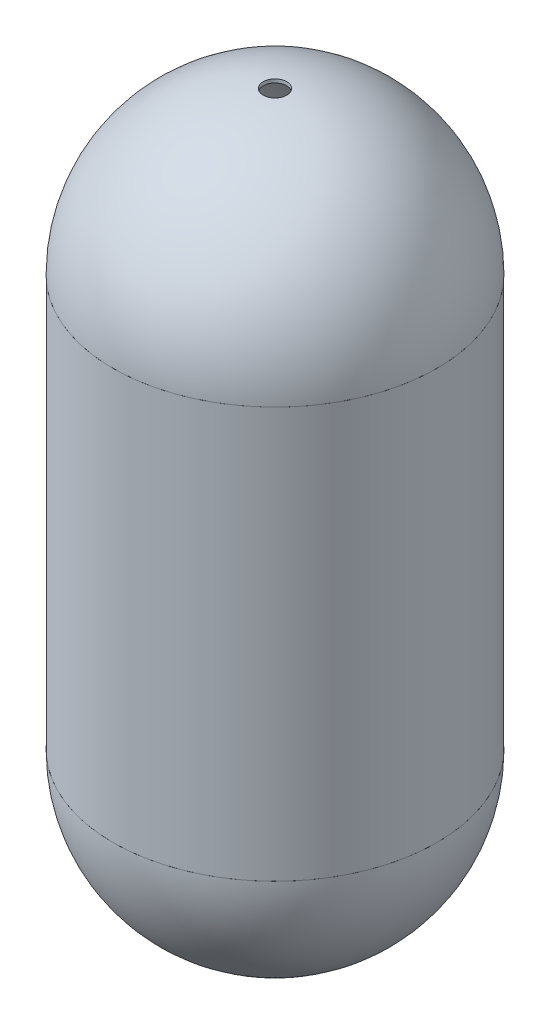
ISO-10303-21;
HEADER;
FILE_DESCRIPTION(('STEP AP214'),'2;1');
FILE_NAME('part.step','',(''),(''),'','','');
FILE_SCHEMA(('AUTOMOTIVE_DESIGN { 1 0 10303 214 1 1 1 1 }'));
ENDSEC;
DATA;
#1=APPLICATION_CONTEXT('core data for automotive mechanical design processes');
#2=APPLICATION_PROTOCOL_DEFINITION('international standard','automotive_design',2000,#1);
#3=PRODUCT_CONTEXT('',#1,'mechanical');
#4=PRODUCT('Part','Part','',(#3));
#5=PRODUCT_RELATED_PRODUCT_CATEGORY('part','',(#4));
#6=PRODUCT_DEFINITION_FORMATION('','',#4);
#7=PRODUCT_DEFINITION_CONTEXT('part definition',#1,'design');
#8=PRODUCT_DEFINITION('design','',#6,#7);
#9=PRODUCT_DEFINITION_SHAPE('','',#8);
#10=(LENGTH_UNIT() NAMED_UNIT(*) SI_UNIT(.MILLI.,.METRE.));
#11=(NAMED_UNIT(*) PLANE_ANGLE_UNIT() SI_UNIT($,.RADIAN.));
#12=(NAMED_UNIT(*) SI_UNIT($,.STERADIAN.) SOLID_ANGLE_UNIT());
#13=UNCERTAINTY_MEASURE_WITH_UNIT(LENGTH_MEASURE(1.E-05),#10,'distance_accuracy_value','');
#14=(GEOMETRIC_REPRESENTATION_CONTEXT(3) GLOBAL_UNCERTAINTY_ASSIGNED_CONTEXT((#13)) GLOBAL_UNIT_ASSIGNED_CONTEXT((#10,
#11,#12)) REPRESENTATION_CONTEXT('',''));
#15=CARTESIAN_POINT('',(0.,0.,0.));
#16=DIRECTION('',(0.,0.,1.));
#17=DIRECTION('',(1.,0.,0.));
#18=AXIS2_PLACEMENT_3D('',#15,#16,#17);
#19=CARTESIAN_POINT('',(0.,306.25,0.));
#20=DIRECTION('',(-0.87529345214149,0.,-0.483592155269533));
#21=DIRECTION('',(0.483592155269533,0.,-0.875293452141491));
#22=AXIS2_PLACEMENT_3D('',#19,#20,#21);
#23=SPHERICAL_SURFACE('',#22,241.5);
#24=CARTESIAN_POINT('',(0.,306.25,0.));
#25=DIRECTION('',(0.,-1.,0.));
#26=DIRECTION('',(-0.483592155269534,0.,0.87529345214149));
#27=AXIS2_PLACEMENT_3D('',#24,#25,#26);
#28=SPHERICAL_SURFACE('',#27,241.5);
#29=CARTESIAN_POINT('',(8.5777669340143E-13,547.115107477194,-1.55824138157594E-12));
#30=DIRECTION('',(0.,-1.,0.));
#31=DIRECTION('',(-0.483592155269534,0.,0.87529345214149));
#32=AXIS2_PLACEMENT_3D('',#29,#30,#31);
#33=CIRCLE('',#32,17.5);
#34=CARTESIAN_POINT('',(8.46286271721769,547.115107477193,-15.3176354124776));
#35=VERTEX_POINT('',#34);
#36=EDGE_CURVE('E55',#35,#35,#33,.T.);
#37=ORIENTED_EDGE('',*,*,#36,.T.);
#38=EDGE_LOOP('',(#37));
#39=FACE_BOUND('',#38,.T.);
#40=CARTESIAN_POINT('',(0.,306.25,0.));
#41=DIRECTION('',(0.,-1.,0.));
#42=DIRECTION('',(-0.483592155269533,0.,0.875293452141491));
#43=AXIS2_PLACEMENT_3D('',#40,#41,#42);
#44=CIRCLE('',#43,241.5);
#45=CARTESIAN_POINT('',(-116.787505497592,306.25,211.38336869217));
#46=VERTEX_POINT('',#45);
#47=EDGE_CURVE('E51',#46,#46,#44,.T.);
#48=ORIENTED_EDGE('',*,*,#47,.F.);
#49=EDGE_LOOP('',(#48));
#50=FACE_BOUND('',#49,.T.);
#51=ADVANCED_FACE('F43',(#39,#50),#28,.T.);
#52=CARTESIAN_POINT('',(0.,306.25,0.));
#53=DIRECTION('',(-0.87529345214149,0.,-0.483592155269533));
#54=DIRECTION('',(0.483592155269533,0.,-0.875293452141491));
#55=AXIS2_PLACEMENT_3D('',#52,#53,#54);
#56=SPHERICAL_SURFACE('',#55,236.25);
#57=CARTESIAN_POINT('',(0.,306.25,0.));
#58=DIRECTION('',(0.,-1.,0.));
#59=DIRECTION('',(-0.483592155269534,0.,0.87529345214149));
#60=AXIS2_PLACEMENT_3D('',#57,#58,#59);
#61=SPHERICAL_SURFACE('',#60,236.25);
#62=CARTESIAN_POINT('',(8.40025315621056E-13,541.850960312135,-1.52609730594379E-12));
#63=DIRECTION('',(0.,-1.,0.));
#64=DIRECTION('',(-0.483592155269534,0.,0.87529345214149));
#65=AXIS2_PLACEMENT_3D('',#62,#63,#64);
#66=CIRCLE('',#65,17.5);
#67=CARTESIAN_POINT('',(8.46286271721767,541.850960312134,-15.3176354124776));
#68=VERTEX_POINT('',#67);
#69=EDGE_CURVE('E47',#68,#68,#66,.F.);
#70=ORIENTED_EDGE('',*,*,#69,.T.);
#71=EDGE_LOOP('',(#70));
#72=FACE_BOUND('',#71,.T.);
#73=CARTESIAN_POINT('',(0.,306.25,0.));
#74=DIRECTION('',(0.,1.,0.));
#75=DIRECTION('',(-0.483592155269533,0.,0.875293452141491));
#76=AXIS2_PLACEMENT_3D('',#73,#74,#75);
#77=CIRCLE('',#76,236.25);
#78=CARTESIAN_POINT('',(-114.248646682427,306.25,206.788078068427));
#79=VERTEX_POINT('',#78);
#80=EDGE_CURVE('E11',#79,#79,#77,.T.);
#81=ORIENTED_EDGE('',*,*,#80,.F.);
#82=EDGE_LOOP('',(#81));
#83=FACE_BOUND('',#82,.T.);
#84=ADVANCED_FACE('F45',(#72,#83),#61,.F.);
#85=CARTESIAN_POINT('',(0.,306.25,0.));
#86=DIRECTION('',(0.,-1.,0.));
#87=DIRECTION('',(-0.483592155269533,0.,0.875293452141491));
#88=AXIS2_PLACEMENT_3D('',#85,#86,#87);
#89=PLANE('',#88);
#90=ORIENTED_EDGE('',*,*,#80,.T.);
#91=EDGE_LOOP('',(#90));
#92=FACE_BOUND('',#91,.T.);
#93=ORIENTED_EDGE('',*,*,#47,.T.);
#94=EDGE_LOOP('',(#93));
#95=FACE_BOUND('',#94,.T.);
#96=ADVANCED_FACE('F69',(#92,#95),#89,.T.);
#97=CARTESIAN_POINT('',(0.,306.2499958,0.));
#98=DIRECTION('',(0.,1.,0.));
#99=DIRECTION('',(0.483592155269534,0.,-0.87529345214149));
#100=AXIS2_PLACEMENT_3D('',#97,#98,#99);
#101=CYLINDRICAL_SURFACE('',#100,17.5);
#102=CARTESIAN_POINT('',(8.46286271721767,541.850960312134,-15.3176354124776));
#103=CARTESIAN_POINT('',(8.46286271721767,541.905795178437,-15.3176354124776));
#104=CARTESIAN_POINT('',(8.46286271721767,541.96063004474,-15.3176354124776));
#105=CARTESIAN_POINT('',(8.46286271721767,542.070299777345,-15.3176354124776));
#106=CARTESIAN_POINT('',(8.46286271721768,542.125134643648,-15.3176354124776));
#107=CARTESIAN_POINT('',(8.46286271721768,542.234804376253,-15.3176354124776));
#108=CARTESIAN_POINT('',(8.46286271721768,542.289639242556,-15.3176354124776));
#109=CARTESIAN_POINT('',(8.46286271721768,542.399308975161,-15.3176354124776));
#110=CARTESIAN_POINT('',(8.46286271721768,542.454143841464,-15.3176354124776));
#111=CARTESIAN_POINT('',(8.46286271721768,542.56381357407,-15.3176354124776));
#112=CARTESIAN_POINT('',(8.46286271721768,542.618648440372,-15.3176354124776));
#113=CARTESIAN_POINT('',(8.46286271721768,542.728318172978,-15.3176354124776));
#114=CARTESIAN_POINT('',(8.46286271721768,542.78315303928,-15.3176354124776));
#115=CARTESIAN_POINT('',(8.46286271721768,542.892822771886,-15.3176354124776));
#116=CARTESIAN_POINT('',(8.46286271721768,542.947657638188,-15.3176354124776));
#117=CARTESIAN_POINT('',(8.46286271721768,543.057327370794,-15.3176354124776));
#118=CARTESIAN_POINT('',(8.46286271721768,543.112162237096,-15.3176354124776));
#119=CARTESIAN_POINT('',(8.46286271721768,543.221831969702,-15.3176354124776));
#120=CARTESIAN_POINT('',(8.46286271721768,543.276666836005,-15.3176354124776));
#121=CARTESIAN_POINT('',(8.46286271721768,543.38633656861,-15.3176354124776));
#122=CARTESIAN_POINT('',(8.46286271721768,543.441171434913,-15.3176354124776));
#123=CARTESIAN_POINT('',(8.46286271721768,543.550841167518,-15.3176354124776));
#124=CARTESIAN_POINT('',(8.46286271721768,543.605676033821,-15.3176354124776));
#125=CARTESIAN_POINT('',(8.46286271721768,543.715345766426,-15.3176354124776));
#126=CARTESIAN_POINT('',(8.46286271721768,543.770180632729,-15.3176354124776));
#127=CARTESIAN_POINT('',(8.46286271721768,543.879850365334,-15.3176354124776));
#128=CARTESIAN_POINT('',(8.46286271721768,543.934685231637,-15.3176354124776));
#129=CARTESIAN_POINT('',(8.46286271721768,544.044354964242,-15.3176354124776));
#130=CARTESIAN_POINT('',(8.46286271721768,544.099189830545,-15.3176354124776));
#131=CARTESIAN_POINT('',(8.46286271721768,544.20885956315,-15.3176354124776));
#132=CARTESIAN_POINT('',(8.46286271721768,544.263694429453,-15.3176354124776));
#133=CARTESIAN_POINT('',(8.46286271721768,544.373364162058,-15.3176354124776));
#134=CARTESIAN_POINT('',(8.46286271721768,544.428199028361,-15.3176354124776));
#135=CARTESIAN_POINT('',(8.46286271721768,544.537868760967,-15.3176354124776));
#136=CARTESIAN_POINT('',(8.46286271721768,544.592703627269,-15.3176354124776));
#137=CARTESIAN_POINT('',(8.46286271721768,544.702373359875,-15.3176354124776));
#138=CARTESIAN_POINT('',(8.46286271721769,544.757208226177,-15.3176354124776));
#139=CARTESIAN_POINT('',(8.46286271721769,544.866877958783,-15.3176354124776));
#140=CARTESIAN_POINT('',(8.46286271721769,544.921712825085,-15.3176354124776));
#141=CARTESIAN_POINT('',(8.46286271721769,545.031382557691,-15.3176354124776));
#142=CARTESIAN_POINT('',(8.46286271721769,545.086217423994,-15.3176354124776));
#143=CARTESIAN_POINT('',(8.46286271721769,545.195887156599,-15.3176354124776));
#144=CARTESIAN_POINT('',(8.46286271721769,545.250722022902,-15.3176354124776));
#145=CARTESIAN_POINT('',(8.46286271721769,545.360391755507,-15.3176354124776));
#146=CARTESIAN_POINT('',(8.46286271721769,545.41522662181,-15.3176354124776));
#147=CARTESIAN_POINT('',(8.46286271721769,545.524896354415,-15.3176354124776));
#148=CARTESIAN_POINT('',(8.46286271721769,545.579731220718,-15.3176354124776));
#149=CARTESIAN_POINT('',(8.46286271721769,545.689400953323,-15.3176354124776));
#150=CARTESIAN_POINT('',(8.46286271721769,545.744235819626,-15.3176354124776));
#151=CARTESIAN_POINT('',(8.46286271721769,545.853905552231,-15.3176354124776));
#152=CARTESIAN_POINT('',(8.46286271721769,545.908740418534,-15.3176354124776));
#153=CARTESIAN_POINT('',(8.46286271721769,546.018410151139,-15.3176354124776));
#154=CARTESIAN_POINT('',(8.46286271721769,546.073245017442,-15.3176354124776));
#155=CARTESIAN_POINT('',(8.46286271721769,546.182914750047,-15.3176354124776));
#156=CARTESIAN_POINT('',(8.46286271721769,546.23774961635,-15.3176354124776));
#157=CARTESIAN_POINT('',(8.46286271721769,546.347419348956,-15.3176354124776));
#158=CARTESIAN_POINT('',(8.46286271721769,546.402254215258,-15.3176354124776));
#159=CARTESIAN_POINT('',(8.46286271721769,546.511923947864,-15.3176354124776));
#160=CARTESIAN_POINT('',(8.46286271721769,546.566758814166,-15.3176354124776));
#161=CARTESIAN_POINT('',(8.46286271721769,546.676428546772,-15.3176354124776));
#162=CARTESIAN_POINT('',(8.46286271721769,546.731263413074,-15.3176354124776));
#163=CARTESIAN_POINT('',(8.46286271721769,546.84093314568,-15.3176354124776));
#164=CARTESIAN_POINT('',(8.46286271721769,546.895768011982,-15.3176354124776));
#165=CARTESIAN_POINT('',(8.46286271721769,547.005437744588,-15.3176354124776));
#166=CARTESIAN_POINT('',(8.46286271721769,547.060272610891,-15.3176354124776));
#167=CARTESIAN_POINT('',(8.46286271721769,547.115107477193,-15.3176354124776));
#168=B_SPLINE_CURVE_WITH_KNOTS('',3,(#102,#103,#104,#105,#106,#107,#108,#109,#110,#111,#112,
#113,#114,#115,#116,#117,#118,#119,#120,#121,#122,#123,#124,#125,#126,#127,#128,#129,#130,#131,
#132,#133,#134,#135,#136,#137,#138,#139,#140,#141,#142,#143,#144,#145,#146,#147,#148,#149,#150,
#151,#152,#153,#154,#155,#156,#157,#158,#159,#160,#161,#162,#163,#164,#165,#166,#167),
.UNSPECIFIED.,.F.,.F.,(4,2,2,2,2,2,2,2,2,2,2,2,2,2,2,2,2,2,2,2,2,2,2,2,2,2,2,2,2,2,2,2,4),(0.,
0.164504598908155,0.329009197816199,0.493513796724243,0.658018395632398,0.822522994540553,
0.987027593448597,1.15153219235664,1.3160367912648,1.48054139017284,1.645045989081,
1.80955058798904,1.97405518689708,2.13855978580524,2.30306438471328,2.46756898362144,
2.63207358252948,2.79657818143764,2.96108278034568,3.12558737925384,3.29009197816188,
3.45459657706992,3.61910117597808,3.78360577488612,3.94811037379428,4.11261497270232,
4.27711957161048,4.44162417051852,4.60612876942668,4.77063336833472,4.93513796724276,
5.09964256615092,5.26414716505896),.UNSPECIFIED.);
#169=EDGE_CURVE('BSEAM66',#68,#35,#168,.T.);
#170=ORIENTED_EDGE('',*,*,#69,.F.);
#171=ORIENTED_EDGE('',*,*,#36,.F.);
#172=ORIENTED_EDGE('',*,*,#169,.T.);
#173=ORIENTED_EDGE('',*,*,#169,.F.);
#174=EDGE_LOOP('',(#170,#172,#171,#173));
#175=FACE_BOUND('',#174,.T.);
#176=ADVANCED_FACE('F66',(#175),#101,.F.);
#177=CLOSED_SHELL('',(#51,#84,#96,#176));
#178=MANIFOLD_SOLID_BREP('B2',#177);
#179=CARTESIAN_POINT('',(0.,-306.25,0.));
#180=DIRECTION('',(-0.145123773166015,0.,0.98941350832807));
#181=DIRECTION('',(0.98941350832807,0.,0.145123773166015));
#182=AXIS2_PLACEMENT_3D('',#179,#180,#181);
#183=SPHERICAL_SURFACE('',#182,241.5);
#184=CARTESIAN_POINT('',(0.,-306.25,0.));
#185=DIRECTION('',(0.,1.,0.));
#186=DIRECTION('',(-0.98941350832807,0.,-0.145123773166014));
#187=AXIS2_PLACEMENT_3D('',#184,#185,#186);
#188=SPHERICAL_SURFACE('',#187,241.5);
#189=CARTESIAN_POINT('',(1.76084660698932E-12,-547.115107477193,2.60933975566774E-13));
#190=DIRECTION('',(0.,1.,0.));
#191=DIRECTION('',(-0.98941350832807,0.,-0.145123773166014));
#192=AXIS2_PLACEMENT_3D('',#189,#190,#191);
#193=CIRCLE('',#192,17.5);
#194=CARTESIAN_POINT('',(17.314736395743,-547.115107477193,2.53966603040551));
#195=VERTEX_POINT('',#194);
#196=EDGE_CURVE('E131',#195,#195,#193,.T.);
#197=ORIENTED_EDGE('',*,*,#196,.T.);
#198=EDGE_LOOP('',(#197));
#199=FACE_BOUND('',#198,.T.);
#200=CARTESIAN_POINT('',(0.,-306.25,0.));
#201=DIRECTION('',(0.,1.,0.));
#202=DIRECTION('',(-0.98941350832807,0.,-0.145123773166015));
#203=AXIS2_PLACEMENT_3D('',#200,#201,#202);
#204=CIRCLE('',#203,241.5);
#205=CARTESIAN_POINT('',(-238.943362261229,-306.25,-35.0473912195926));
#206=VERTEX_POINT('',#205);
#207=EDGE_CURVE('E127',#206,#206,#204,.T.);
#208=ORIENTED_EDGE('',*,*,#207,.F.);
#209=EDGE_LOOP('',(#208));
#210=FACE_BOUND('',#209,.T.);
#211=ADVANCED_FACE('F119',(#199,#210),#188,.T.);
#212=CARTESIAN_POINT('',(0.,-306.25,0.));
#213=DIRECTION('',(-0.145123773166015,0.,0.98941350832807));
#214=DIRECTION('',(0.98941350832807,0.,0.145123773166015));
#215=AXIS2_PLACEMENT_3D('',#212,#213,#214);
#216=SPHERICAL_SURFACE('',#215,236.25);
#217=CARTESIAN_POINT('',(0.,-306.25,0.));
#218=DIRECTION('',(0.,1.,0.));
#219=DIRECTION('',(-0.98941350832807,0.,-0.145123773166014));
#220=AXIS2_PLACEMENT_3D('',#217,#218,#219);
#221=SPHERICAL_SURFACE('',#220,236.25);
#222=CARTESIAN_POINT('',(1.72448706927959E-12,-541.850960312134,2.55596415280697E-13));
#223=DIRECTION('',(0.,1.,0.));
#224=DIRECTION('',(-0.98941350832807,0.,-0.145123773166014));
#225=AXIS2_PLACEMENT_3D('',#222,#223,#224);
#226=CIRCLE('',#225,17.5);
#227=CARTESIAN_POINT('',(17.3147363957429,-541.850960312134,2.53966603040551));
#228=VERTEX_POINT('',#227);
#229=EDGE_CURVE('E123',#228,#228,#226,.F.);
#230=ORIENTED_EDGE('',*,*,#229,.T.);
#231=EDGE_LOOP('',(#230));
#232=FACE_BOUND('',#231,.T.);
#233=CARTESIAN_POINT('',(0.,-306.25,0.));
#234=DIRECTION('',(0.,-1.,0.));
#235=DIRECTION('',(-0.98941350832807,0.,-0.145123773166015));
#236=AXIS2_PLACEMENT_3D('',#233,#234,#235);
#237=CIRCLE('',#236,236.25);
#238=CARTESIAN_POINT('',(-233.748941342506,-306.25,-34.285491410471));
#239=VERTEX_POINT('',#238);
#240=EDGE_CURVE('E42',#239,#239,#237,.T.);
#241=ORIENTED_EDGE('',*,*,#240,.F.);
#242=EDGE_LOOP('',(#241));
#243=FACE_BOUND('',#242,.T.);
#244=ADVANCED_FACE('F121',(#232,#243),#221,.F.);
#245=CARTESIAN_POINT('',(0.,-306.25,0.));
#246=DIRECTION('',(0.,1.,0.));
#247=DIRECTION('',(-0.98941350832807,0.,-0.145123773166015));
#248=AXIS2_PLACEMENT_3D('',#245,#246,#247);
#249=PLANE('',#248);
#250=ORIENTED_EDGE('',*,*,#240,.T.);
#251=EDGE_LOOP('',(#250));
#252=FACE_BOUND('',#251,.T.);
#253=ORIENTED_EDGE('',*,*,#207,.T.);
#254=EDGE_LOOP('',(#253));
#255=FACE_BOUND('',#254,.T.);
#256=ADVANCED_FACE('F145',(#252,#255),#249,.T.);
#257=CARTESIAN_POINT('',(0.,-306.2499958,0.));
#258=DIRECTION('',(0.,-1.,0.));
#259=DIRECTION('',(0.98941350832807,0.,0.145123773166014));
#260=AXIS2_PLACEMENT_3D('',#257,#258,#259);
#261=CYLINDRICAL_SURFACE('',#260,17.5);
#262=CARTESIAN_POINT('',(17.3147363957429,-541.850960312134,2.53966603040551));
#263=CARTESIAN_POINT('',(17.3147363957429,-541.905795178437,2.53966603040551));
#264=CARTESIAN_POINT('',(17.3147363957429,-541.96063004474,2.53966603040551));
#265=CARTESIAN_POINT('',(17.3147363957429,-542.070299777345,2.53966603040551));
#266=CARTESIAN_POINT('',(17.314736395743,-542.125134643648,2.53966603040551));
#267=CARTESIAN_POINT('',(17.314736395743,-542.234804376253,2.53966603040551));
#268=CARTESIAN_POINT('',(17.314736395743,-542.289639242556,2.53966603040551));
#269=CARTESIAN_POINT('',(17.314736395743,-542.399308975161,2.53966603040551));
#270=CARTESIAN_POINT('',(17.314736395743,-542.454143841464,2.53966603040551));
#271=CARTESIAN_POINT('',(17.314736395743,-542.563813574069,2.53966603040551));
#272=CARTESIAN_POINT('',(17.314736395743,-542.618648440372,2.53966603040551));
#273=CARTESIAN_POINT('',(17.314736395743,-542.728318172977,2.53966603040551));
#274=CARTESIAN_POINT('',(17.314736395743,-542.78315303928,2.53966603040551));
#275=CARTESIAN_POINT('',(17.314736395743,-542.892822771886,2.53966603040551));
#276=CARTESIAN_POINT('',(17.314736395743,-542.947657638188,2.53966603040551));
#277=CARTESIAN_POINT('',(17.314736395743,-543.057327370794,2.53966603040551));
#278=CARTESIAN_POINT('',(17.314736395743,-543.112162237096,2.53966603040551));
#279=CARTESIAN_POINT('',(17.314736395743,-543.221831969702,2.53966603040551));
#280=CARTESIAN_POINT('',(17.314736395743,-543.276666836004,2.53966603040551));
#281=CARTESIAN_POINT('',(17.314736395743,-543.38633656861,2.53966603040551));
#282=CARTESIAN_POINT('',(17.314736395743,-543.441171434912,2.53966603040551));
#283=CARTESIAN_POINT('',(17.314736395743,-543.550841167518,2.53966603040551));
#284=CARTESIAN_POINT('',(17.314736395743,-543.605676033821,2.53966603040551));
#285=CARTESIAN_POINT('',(17.314736395743,-543.715345766426,2.53966603040551));
#286=CARTESIAN_POINT('',(17.314736395743,-543.770180632729,2.53966603040551));
#287=CARTESIAN_POINT('',(17.314736395743,-543.879850365334,2.53966603040551));
#288=CARTESIAN_POINT('',(17.314736395743,-543.934685231637,2.53966603040551));
#289=CARTESIAN_POINT('',(17.314736395743,-544.044354964242,2.53966603040551));
#290=CARTESIAN_POINT('',(17.314736395743,-544.099189830545,2.53966603040551));
#291=CARTESIAN_POINT('',(17.314736395743,-544.20885956315,2.53966603040551));
#292=CARTESIAN_POINT('',(17.314736395743,-544.263694429453,2.53966603040551));
#293=CARTESIAN_POINT('',(17.314736395743,-544.373364162058,2.53966603040551));
#294=CARTESIAN_POINT('',(17.314736395743,-544.428199028361,2.53966603040551));
#295=CARTESIAN_POINT('',(17.314736395743,-544.537868760966,2.53966603040551));
#296=CARTESIAN_POINT('',(17.314736395743,-544.592703627269,2.53966603040551));
#297=CARTESIAN_POINT('',(17.314736395743,-544.702373359875,2.53966603040551));
#298=CARTESIAN_POINT('',(17.314736395743,-544.757208226177,2.53966603040551));
#299=CARTESIAN_POINT('',(17.314736395743,-544.866877958783,2.53966603040551));
#300=CARTESIAN_POINT('',(17.314736395743,-544.921712825085,2.53966603040551));
#301=CARTESIAN_POINT('',(17.314736395743,-545.031382557691,2.53966603040551));
#302=CARTESIAN_POINT('',(17.314736395743,-545.086217423993,2.53966603040551));
#303=CARTESIAN_POINT('',(17.314736395743,-545.195887156599,2.53966603040551));
#304=CARTESIAN_POINT('',(17.314736395743,-545.250722022902,2.53966603040551));
#305=CARTESIAN_POINT('',(17.314736395743,-545.360391755507,2.53966603040551));
#306=CARTESIAN_POINT('',(17.314736395743,-545.41522662181,2.53966603040551));
#307=CARTESIAN_POINT('',(17.314736395743,-545.524896354415,2.53966603040551));
#308=CARTESIAN_POINT('',(17.314736395743,-545.579731220718,2.53966603040551));
#309=CARTESIAN_POINT('',(17.314736395743,-545.689400953323,2.53966603040551));
#310=CARTESIAN_POINT('',(17.314736395743,-545.744235819626,2.53966603040551));
#311=CARTESIAN_POINT('',(17.314736395743,-545.853905552231,2.53966603040551));
#312=CARTESIAN_POINT('',(17.314736395743,-545.908740418534,2.53966603040551));
#313=CARTESIAN_POINT('',(17.314736395743,-546.018410151139,2.53966603040551));
#314=CARTESIAN_POINT('',(17.314736395743,-546.073245017442,2.53966603040551));
#315=CARTESIAN_POINT('',(17.314736395743,-546.182914750047,2.53966603040551));
#316=CARTESIAN_POINT('',(17.314736395743,-546.23774961635,2.53966603040551));
#317=CARTESIAN_POINT('',(17.314736395743,-546.347419348955,2.53966603040551));
#318=CARTESIAN_POINT('',(17.314736395743,-546.402254215258,2.53966603040551));
#319=CARTESIAN_POINT('',(17.314736395743,-546.511923947863,2.53966603040551));
#320=CARTESIAN_POINT('',(17.314736395743,-546.566758814166,2.53966603040551));
#321=CARTESIAN_POINT('',(17.314736395743,-546.676428546772,2.53966603040551));
#322=CARTESIAN_POINT('',(17.314736395743,-546.731263413074,2.53966603040551));
#323=CARTESIAN_POINT('',(17.314736395743,-546.84093314568,2.53966603040551));
#324=CARTESIAN_POINT('',(17.314736395743,-546.895768011982,2.53966603040551));
#325=CARTESIAN_POINT('',(17.314736395743,-547.005437744588,2.53966603040551));
#326=CARTESIAN_POINT('',(17.314736395743,-547.06027261089,2.53966603040551));
#327=CARTESIAN_POINT('',(17.314736395743,-547.115107477193,2.53966603040551));
#328=B_SPLINE_CURVE_WITH_KNOTS('',3,(#262,#263,#264,#265,#266,#267,#268,#269,#270,#271,#272,
#273,#274,#275,#276,#277,#278,#279,#280,#281,#282,#283,#284,#285,#286,#287,#288,#289,#290,#291,
#292,#293,#294,#295,#296,#297,#298,#299,#300,#301,#302,#303,#304,#305,#306,#307,#308,#309,#310,
#311,#312,#313,#314,#315,#316,#317,#318,#319,#320,#321,#322,#323,#324,#325,#326,#327),
.UNSPECIFIED.,.F.,.F.,(4,2,2,2,2,2,2,2,2,2,2,2,2,2,2,2,2,2,2,2,2,2,2,2,2,2,2,2,2,2,2,2,4),(0.,
0.164504598908155,0.32900919781631,0.493513796724354,0.658018395632398,0.822522994540553,
0.987027593448597,1.15153219235675,1.3160367912648,1.48054139017284,1.645045989081,
1.80955058798904,1.97405518689719,2.13855978580524,2.30306438471328,2.46756898362144,
2.63207358252959,2.79657818143764,2.96108278034568,3.12558737925384,3.29009197816188,
3.45459657707003,3.61910117597808,3.78360577488612,3.94811037379428,4.11261497270243,
4.27711957161048,4.44162417051852,4.60612876942668,4.77063336833472,4.93513796724288,
5.09964256615092,5.26414716505896),.UNSPECIFIED.);
#329=EDGE_CURVE('BSEAM142',#228,#195,#328,.T.);
#330=ORIENTED_EDGE('',*,*,#229,.F.);
#331=ORIENTED_EDGE('',*,*,#196,.F.);
#332=ORIENTED_EDGE('',*,*,#329,.T.);
#333=ORIENTED_EDGE('',*,*,#329,.F.);
#334=EDGE_LOOP('',(#330,#332,#331,#333));
#335=FACE_BOUND('',#334,.T.);
#336=ADVANCED_FACE('F142',(#335),#261,.F.);
#337=CLOSED_SHELL('',(#211,#244,#256,#336));
#338=MANIFOLD_SOLID_BREP('B6',#337);
#339=CARTESIAN_POINT('',(0.,306.25,0.));
#340=DIRECTION('',(0.,-1.,0.));
#341=DIRECTION('',(0.,0.,-1.));
#342=AXIS2_PLACEMENT_3D('',#339,#340,#341);
#343=CYLINDRICAL_SURFACE('',#342,241.5);
#344=CARTESIAN_POINT('',(0.,306.25,0.));
#345=DIRECTION('',(0.,1.,0.));
#346=DIRECTION('',(0.,0.,1.));
#347=AXIS2_PLACEMENT_3D('',#344,#345,#346);
#348=CIRCLE('',#347,241.5);
#349=CARTESIAN_POINT('',(0.,306.25,241.5));
#350=VERTEX_POINT('',#349);
#351=EDGE_CURVE('E118',#350,#350,#348,.T.);
#352=ORIENTED_EDGE('',*,*,#351,.F.);
#353=EDGE_LOOP('',(#352));
#354=FACE_BOUND('',#353,.T.);
#355=CARTESIAN_POINT('',(0.,-306.25,0.));
#356=DIRECTION('',(0.,1.,0.));
#357=DIRECTION('',(0.,0.,1.));
#358=AXIS2_PLACEMENT_3D('',#355,#356,#357);
#359=CIRCLE('',#358,241.5);
#360=CARTESIAN_POINT('',(0.,-306.25,241.5));
#361=VERTEX_POINT('',#360);
#362=EDGE_CURVE('E191',#361,#361,#359,.T.);
#363=ORIENTED_EDGE('',*,*,#362,.T.);
#364=EDGE_LOOP('',(#363));
#365=FACE_BOUND('',#364,.T.);
#366=ADVANCED_FACE('F188',(#354,#365),#343,.T.);
#367=CARTESIAN_POINT('',(0.,306.25,0.));
#368=DIRECTION('',(0.,1.,0.));
#369=DIRECTION('',(0.,0.,1.));
#370=AXIS2_PLACEMENT_3D('',#367,#368,#369);
#371=PLANE('',#370);
#372=CARTESIAN_POINT('',(0.,306.25,0.));
#373=DIRECTION('',(0.,1.,0.));
#374=DIRECTION('',(0.,0.,1.));
#375=AXIS2_PLACEMENT_3D('',#372,#373,#374);
#376=CIRCLE('',#375,236.25);
#377=CARTESIAN_POINT('',(0.,306.25,236.25));
#378=VERTEX_POINT('',#377);
#379=EDGE_CURVE('E202',#378,#378,#376,.T.);
#380=ORIENTED_EDGE('',*,*,#379,.F.);
#381=EDGE_LOOP('',(#380));
#382=FACE_BOUND('',#381,.T.);
#383=ORIENTED_EDGE('',*,*,#351,.T.);
#384=EDGE_LOOP('',(#383));
#385=FACE_BOUND('',#384,.T.);
#386=ADVANCED_FACE('F208',(#382,#385),#371,.T.);
#387=CARTESIAN_POINT('',(0.,-306.25,0.));
#388=DIRECTION('',(0.,1.,0.));
#389=DIRECTION('',(0.,0.,1.));
#390=AXIS2_PLACEMENT_3D('',#387,#388,#389);
#391=PLANE('',#390);
#392=CARTESIAN_POINT('',(0.,-306.25,0.));
#393=DIRECTION('',(0.,1.,0.));
#394=DIRECTION('',(0.,0.,1.));
#395=AXIS2_PLACEMENT_3D('',#392,#393,#394);
#396=CIRCLE('',#395,236.25);
#397=CARTESIAN_POINT('',(0.,-306.25,236.25));
#398=VERTEX_POINT('',#397);
#399=EDGE_CURVE('E198',#398,#398,#396,.T.);
#400=ORIENTED_EDGE('',*,*,#399,.T.);
#401=EDGE_LOOP('',(#400));
#402=FACE_BOUND('',#401,.T.);
#403=ORIENTED_EDGE('',*,*,#362,.F.);
#404=EDGE_LOOP('',(#403));
#405=FACE_BOUND('',#404,.T.);
#406=ADVANCED_FACE('F210',(#402,#405),#391,.F.);
#407=CARTESIAN_POINT('',(0.,-306.25,0.));
#408=DIRECTION('',(0.,1.,0.));
#409=DIRECTION('',(0.,0.,1.));
#410=AXIS2_PLACEMENT_3D('',#407,#408,#409);
#411=CYLINDRICAL_SURFACE('',#410,236.25);
#412=ORIENTED_EDGE('',*,*,#399,.F.);
#413=EDGE_LOOP('',(#412));
#414=FACE_BOUND('',#413,.T.);
#415=ORIENTED_EDGE('',*,*,#379,.T.);
#416=EDGE_LOOP('',(#415));
#417=FACE_BOUND('',#416,.T.);
#418=ADVANCED_FACE('F206',(#414,#417),#411,.F.);
#419=CLOSED_SHELL('',(#366,#386,#406,#418));
#420=MANIFOLD_SOLID_BREP('B37',#419);
#421=ADVANCED_BREP_SHAPE_REPRESENTATION('',(#18,#178,#338,#420),#14);
#422=SHAPE_DEFINITION_REPRESENTATION(#9,#421);
ENDSEC;
END-ISO-10303-21;
